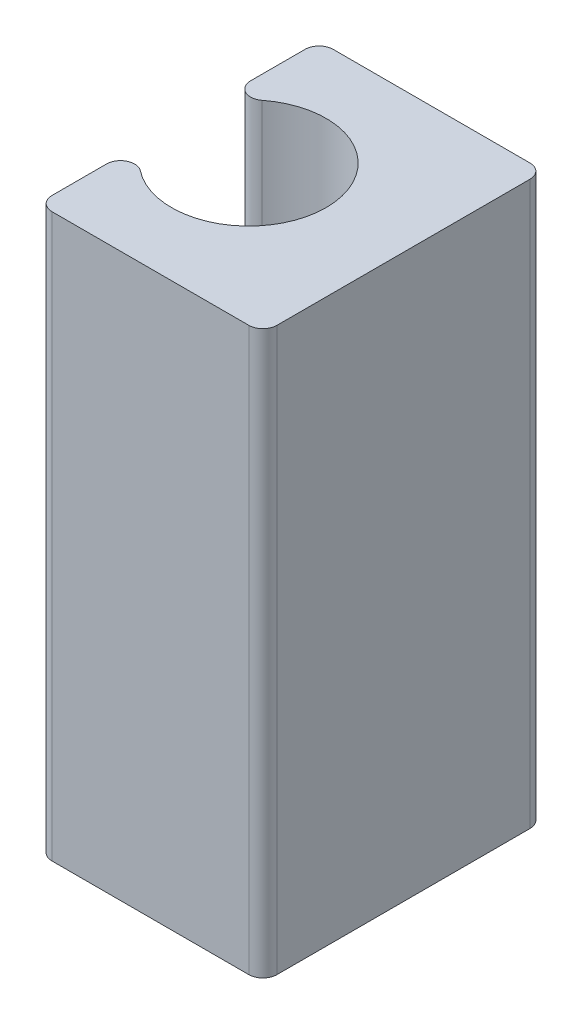
ISO-10303-21;
HEADER;
FILE_DESCRIPTION(('STEP AP214'),'2;1');
FILE_NAME('part.step','',(''),(''),'','','');
FILE_SCHEMA(('AUTOMOTIVE_DESIGN { 1 0 10303 214 1 1 1 1 }'));
ENDSEC;
DATA;
#1=APPLICATION_CONTEXT('core data for automotive mechanical design processes');
#2=APPLICATION_PROTOCOL_DEFINITION('international standard','automotive_design',2000,#1);
#3=PRODUCT_CONTEXT('',#1,'mechanical');
#4=PRODUCT('Part','Part','',(#3));
#5=PRODUCT_RELATED_PRODUCT_CATEGORY('part','',(#4));
#6=PRODUCT_DEFINITION_FORMATION('','',#4);
#7=PRODUCT_DEFINITION_CONTEXT('part definition',#1,'design');
#8=PRODUCT_DEFINITION('design','',#6,#7);
#9=PRODUCT_DEFINITION_SHAPE('','',#8);
#10=(LENGTH_UNIT() NAMED_UNIT(*) SI_UNIT(.MILLI.,.METRE.));
#11=(NAMED_UNIT(*) PLANE_ANGLE_UNIT() SI_UNIT($,.RADIAN.));
#12=(NAMED_UNIT(*) SI_UNIT($,.STERADIAN.) SOLID_ANGLE_UNIT());
#13=UNCERTAINTY_MEASURE_WITH_UNIT(LENGTH_MEASURE(1.E-05),#10,'distance_accuracy_value','');
#14=(GEOMETRIC_REPRESENTATION_CONTEXT(3) GLOBAL_UNCERTAINTY_ASSIGNED_CONTEXT((#13)) GLOBAL_UNIT_ASSIGNED_CONTEXT((#10,
#11,#12)) REPRESENTATION_CONTEXT('',''));
#15=CARTESIAN_POINT('',(0.,0.,0.));
#16=DIRECTION('',(0.,0.,1.));
#17=DIRECTION('',(1.,0.,0.));
#18=AXIS2_PLACEMENT_3D('',#15,#16,#17);
#19=CARTESIAN_POINT('',(20.65,50.4,-20.6));
#20=DIRECTION('',(0.,-1.,0.));
#21=DIRECTION('',(0.,0.,-1.));
#22=AXIS2_PLACEMENT_3D('',#19,#20,#21);
#23=CYLINDRICAL_SURFACE('',#22,2.75);
#24=CARTESIAN_POINT('',(20.65,50.4,-20.6));
#25=DIRECTION('',(0.,-1.,0.));
#26=DIRECTION('',(0.,0.,-1.));
#27=AXIS2_PLACEMENT_3D('',#24,#25,#26);
#28=CIRCLE('',#27,2.75);
#29=CARTESIAN_POINT('',(18.9576923076923,50.4,-22.7676242004915));
#30=VERTEX_POINT('',#29);
#31=CARTESIAN_POINT('',(18.9576923076923,50.4,-18.4323757995085));
#32=VERTEX_POINT('',#31);
#33=EDGE_CURVE('E150',#30,#32,#28,.T.);
#34=ORIENTED_EDGE('',*,*,#33,.F.);
#35=DIRECTION('',(0.,-1.,0.));
#36=VECTOR('',#35,1.);
#37=CARTESIAN_POINT('',(18.9576923076923,50.4,-22.7676242004915));
#38=LINE('',#37,#36);
#39=CARTESIAN_POINT('',(18.9576923076923,30.4,-22.7676242004915));
#40=VERTEX_POINT('',#39);
#41=EDGE_CURVE('E11',#30,#40,#38,.T.);
#42=ORIENTED_EDGE('',*,*,#41,.T.);
#43=CARTESIAN_POINT('',(20.65,30.4,-20.6));
#44=DIRECTION('',(0.,-1.,0.));
#45=DIRECTION('',(0.,0.,-1.));
#46=AXIS2_PLACEMENT_3D('',#43,#44,#45);
#47=CIRCLE('',#46,2.75);
#48=CARTESIAN_POINT('',(18.9576923076923,30.4,-18.4323757995085));
#49=VERTEX_POINT('',#48);
#50=EDGE_CURVE('E200',#40,#49,#47,.T.);
#51=ORIENTED_EDGE('',*,*,#50,.T.);
#52=DIRECTION('',(0.,-1.,0.));
#53=VECTOR('',#52,1.);
#54=CARTESIAN_POINT('',(18.9576923076923,50.4,-18.4323757995085));
#55=LINE('',#54,#53);
#56=EDGE_CURVE('E40',#49,#32,#55,.F.);
#57=ORIENTED_EDGE('',*,*,#56,.T.);
#58=EDGE_LOOP('',(#34,#42,#51,#57));
#59=FACE_BOUND('',#58,.T.);
#60=ADVANCED_FACE('F32',(#59),#23,.F.);
#61=CARTESIAN_POINT('',(18.15,50.4,-15.6));
#62=DIRECTION('',(1.,0.,0.));
#63=DIRECTION('',(0.,0.,-1.));
#64=AXIS2_PLACEMENT_3D('',#61,#62,#63);
#65=PLANE('',#64);
#66=DIRECTION('',(0.,0.,1.));
#67=VECTOR('',#66,1.);
#68=CARTESIAN_POINT('',(18.15,30.4,-15.6));
#69=LINE('',#68,#67);
#70=CARTESIAN_POINT('',(18.15,30.4,-18.0382623085101));
#71=VERTEX_POINT('',#70);
#72=CARTESIAN_POINT('',(18.15,30.4,-16.1));
#73=VERTEX_POINT('',#72);
#74=EDGE_CURVE('E213',#71,#73,#69,.T.);
#75=ORIENTED_EDGE('',*,*,#74,.T.);
#76=DIRECTION('',(0.,-1.,0.));
#77=VECTOR('',#76,1.);
#78=CARTESIAN_POINT('',(18.15,50.4,-16.1));
#79=LINE('',#78,#77);
#80=CARTESIAN_POINT('',(18.15,50.4,-16.1));
#81=VERTEX_POINT('',#80);
#82=EDGE_CURVE('E194',#73,#81,#79,.F.);
#83=ORIENTED_EDGE('',*,*,#82,.T.);
#84=DIRECTION('',(0.,0.,1.));
#85=VECTOR('',#84,1.);
#86=CARTESIAN_POINT('',(18.15,50.4,-19.454356076261));
#87=LINE('',#86,#85);
#88=CARTESIAN_POINT('',(18.15,50.4,-18.0382623085101));
#89=VERTEX_POINT('',#88);
#90=EDGE_CURVE('E154',#89,#81,#87,.T.);
#91=ORIENTED_EDGE('',*,*,#90,.F.);
#92=DIRECTION('',(0.,-1.,0.));
#93=VECTOR('',#92,1.);
#94=CARTESIAN_POINT('',(18.15,50.4,-18.0382623085101));
#95=LINE('',#94,#93);
#96=EDGE_CURVE('E191',#89,#71,#95,.T.);
#97=ORIENTED_EDGE('',*,*,#96,.T.);
#98=EDGE_LOOP('',(#75,#83,#91,#97));
#99=FACE_BOUND('',#98,.T.);
#100=ADVANCED_FACE('F212',(#99),#65,.F.);
#101=CARTESIAN_POINT('',(26.15,50.4,-15.6));
#102=DIRECTION('',(0.,0.,-1.));
#103=DIRECTION('',(-1.,0.,0.));
#104=AXIS2_PLACEMENT_3D('',#101,#102,#103);
#105=PLANE('',#104);
#106=DIRECTION('',(1.,0.,0.));
#107=VECTOR('',#106,1.);
#108=CARTESIAN_POINT('',(26.15,30.4,-15.6));
#109=LINE('',#108,#107);
#110=CARTESIAN_POINT('',(18.65,30.4,-15.6));
#111=VERTEX_POINT('',#110);
#112=CARTESIAN_POINT('',(25.65,30.4,-15.6));
#113=VERTEX_POINT('',#112);
#114=EDGE_CURVE('E216',#111,#113,#109,.T.);
#115=ORIENTED_EDGE('',*,*,#114,.T.);
#116=DIRECTION('',(0.,-1.,0.));
#117=VECTOR('',#116,1.);
#118=CARTESIAN_POINT('',(25.65,50.4,-15.6));
#119=LINE('',#118,#117);
#120=CARTESIAN_POINT('',(25.65,50.4,-15.6));
#121=VERTEX_POINT('',#120);
#122=EDGE_CURVE('E189',#113,#121,#119,.F.);
#123=ORIENTED_EDGE('',*,*,#122,.T.);
#124=DIRECTION('',(1.,0.,0.));
#125=VECTOR('',#124,1.);
#126=CARTESIAN_POINT('',(26.15,50.4,-15.6));
#127=LINE('',#126,#125);
#128=CARTESIAN_POINT('',(18.65,50.4,-15.6));
#129=VERTEX_POINT('',#128);
#130=EDGE_CURVE('E235',#129,#121,#127,.T.);
#131=ORIENTED_EDGE('',*,*,#130,.F.);
#132=DIRECTION('',(0.,-1.,0.));
#133=VECTOR('',#132,1.);
#134=CARTESIAN_POINT('',(18.65,50.4,-15.6));
#135=LINE('',#134,#133);
#136=EDGE_CURVE('E186',#129,#111,#135,.T.);
#137=ORIENTED_EDGE('',*,*,#136,.T.);
#138=EDGE_LOOP('',(#115,#123,#131,#137));
#139=FACE_BOUND('',#138,.T.);
#140=ADVANCED_FACE('F245',(#139),#105,.F.);
#141=CARTESIAN_POINT('',(26.15,50.4,-25.6));
#142=DIRECTION('',(-1.,0.,0.));
#143=DIRECTION('',(0.,0.,1.));
#144=AXIS2_PLACEMENT_3D('',#141,#142,#143);
#145=PLANE('',#144);
#146=DIRECTION('',(0.,0.,-1.));
#147=VECTOR('',#146,1.);
#148=CARTESIAN_POINT('',(26.15,30.4,-25.6));
#149=LINE('',#148,#147);
#150=CARTESIAN_POINT('',(26.15,30.4,-16.1));
#151=VERTEX_POINT('',#150);
#152=CARTESIAN_POINT('',(26.15,30.4,-25.1));
#153=VERTEX_POINT('',#152);
#154=EDGE_CURVE('E156',#151,#153,#149,.T.);
#155=ORIENTED_EDGE('',*,*,#154,.T.);
#156=DIRECTION('',(0.,-1.,0.));
#157=VECTOR('',#156,1.);
#158=CARTESIAN_POINT('',(26.15,50.4,-25.1));
#159=LINE('',#158,#157);
#160=CARTESIAN_POINT('',(26.15,50.4,-25.1));
#161=VERTEX_POINT('',#160);
#162=EDGE_CURVE('E47',#153,#161,#159,.F.);
#163=ORIENTED_EDGE('',*,*,#162,.T.);
#164=DIRECTION('',(0.,0.,-1.));
#165=VECTOR('',#164,1.);
#166=CARTESIAN_POINT('',(26.15,50.4,-25.6));
#167=LINE('',#166,#165);
#168=CARTESIAN_POINT('',(26.15,50.4,-16.1));
#169=VERTEX_POINT('',#168);
#170=EDGE_CURVE('E231',#169,#161,#167,.T.);
#171=ORIENTED_EDGE('',*,*,#170,.F.);
#172=DIRECTION('',(0.,-1.,0.));
#173=VECTOR('',#172,1.);
#174=CARTESIAN_POINT('',(26.15,50.4,-16.1));
#175=LINE('',#174,#173);
#176=EDGE_CURVE('E182',#169,#151,#175,.T.);
#177=ORIENTED_EDGE('',*,*,#176,.T.);
#178=EDGE_LOOP('',(#155,#163,#171,#177));
#179=FACE_BOUND('',#178,.T.);
#180=ADVANCED_FACE('F223',(#179),#145,.F.);
#181=CARTESIAN_POINT('',(18.15,50.4,-25.6));
#182=DIRECTION('',(0.,0.,1.));
#183=DIRECTION('',(1.,0.,0.));
#184=AXIS2_PLACEMENT_3D('',#181,#182,#183);
#185=PLANE('',#184);
#186=DIRECTION('',(-1.,0.,0.));
#187=VECTOR('',#186,1.);
#188=CARTESIAN_POINT('',(18.15,30.4,-25.6));
#189=LINE('',#188,#187);
#190=CARTESIAN_POINT('',(25.65,30.4,-25.6));
#191=VERTEX_POINT('',#190);
#192=CARTESIAN_POINT('',(18.65,30.4,-25.6));
#193=VERTEX_POINT('',#192);
#194=EDGE_CURVE('E151',#191,#193,#189,.T.);
#195=ORIENTED_EDGE('',*,*,#194,.T.);
#196=DIRECTION('',(0.,-1.,0.));
#197=VECTOR('',#196,1.);
#198=CARTESIAN_POINT('',(18.65,50.4,-25.6));
#199=LINE('',#198,#197);
#200=CARTESIAN_POINT('',(18.65,50.4,-25.6));
#201=VERTEX_POINT('',#200);
#202=EDGE_CURVE('E128',#193,#201,#199,.F.);
#203=ORIENTED_EDGE('',*,*,#202,.T.);
#204=DIRECTION('',(-1.,0.,0.));
#205=VECTOR('',#204,1.);
#206=CARTESIAN_POINT('',(18.15,50.4,-25.6));
#207=LINE('',#206,#205);
#208=CARTESIAN_POINT('',(25.65,50.4,-25.6));
#209=VERTEX_POINT('',#208);
#210=EDGE_CURVE('E230',#209,#201,#207,.T.);
#211=ORIENTED_EDGE('',*,*,#210,.F.);
#212=DIRECTION('',(0.,-1.,0.));
#213=VECTOR('',#212,1.);
#214=CARTESIAN_POINT('',(25.65,50.4,-25.6));
#215=LINE('',#214,#213);
#216=EDGE_CURVE('E133',#209,#191,#215,.T.);
#217=ORIENTED_EDGE('',*,*,#216,.T.);
#218=EDGE_LOOP('',(#195,#203,#211,#217));
#219=FACE_BOUND('',#218,.T.);
#220=ADVANCED_FACE('F233',(#219),#185,.F.);
#221=CARTESIAN_POINT('',(18.15,50.4,-24.6388736053509));
#222=DIRECTION('',(1.,0.,0.));
#223=DIRECTION('',(0.,0.,-1.));
#224=AXIS2_PLACEMENT_3D('',#221,#222,#223);
#225=PLANE('',#224);
#226=DIRECTION('',(0.,0.,1.));
#227=VECTOR('',#226,1.);
#228=CARTESIAN_POINT('',(18.15,50.4,-24.6388736053509));
#229=LINE('',#228,#227);
#230=CARTESIAN_POINT('',(18.15,50.4,-25.1));
#231=VERTEX_POINT('',#230);
#232=CARTESIAN_POINT('',(18.15,50.4,-23.1617376914899));
#233=VERTEX_POINT('',#232);
#234=EDGE_CURVE('E143',#231,#233,#229,.T.);
#235=ORIENTED_EDGE('',*,*,#234,.F.);
#236=DIRECTION('',(0.,-1.,0.));
#237=VECTOR('',#236,1.);
#238=CARTESIAN_POINT('',(18.15,50.4,-25.1));
#239=LINE('',#238,#237);
#240=CARTESIAN_POINT('',(18.15,30.4,-25.1));
#241=VERTEX_POINT('',#240);
#242=EDGE_CURVE('E127',#231,#241,#239,.T.);
#243=ORIENTED_EDGE('',*,*,#242,.T.);
#244=DIRECTION('',(0.,0.,1.));
#245=VECTOR('',#244,1.);
#246=CARTESIAN_POINT('',(18.15,30.4,-24.6388736053509));
#247=LINE('',#246,#245);
#248=CARTESIAN_POINT('',(18.15,30.4,-23.1617376914899));
#249=VERTEX_POINT('',#248);
#250=EDGE_CURVE('E140',#241,#249,#247,.T.);
#251=ORIENTED_EDGE('',*,*,#250,.T.);
#252=DIRECTION('',(0.,-1.,0.));
#253=VECTOR('',#252,1.);
#254=CARTESIAN_POINT('',(18.15,50.4,-23.1617376914899));
#255=LINE('',#254,#253);
#256=EDGE_CURVE('E145',#249,#233,#255,.F.);
#257=ORIENTED_EDGE('',*,*,#256,.T.);
#258=EDGE_LOOP('',(#235,#243,#251,#257));
#259=FACE_BOUND('',#258,.T.);
#260=ADVANCED_FACE('F139',(#259),#225,.F.);
#261=CARTESIAN_POINT('',(20.65,50.4,-20.6));
#262=DIRECTION('',(0.,-1.,0.));
#263=DIRECTION('',(0.,0.,-1.));
#264=AXIS2_PLACEMENT_3D('',#261,#262,#263);
#265=PLANE('',#264);
#266=ORIENTED_EDGE('',*,*,#210,.T.);
#267=CARTESIAN_POINT('',(18.65,50.4,-25.1));
#268=DIRECTION('',(0.,-1.,0.));
#269=DIRECTION('',(0.,0.,-1.));
#270=AXIS2_PLACEMENT_3D('',#267,#268,#269);
#271=CIRCLE('',#270,0.5);
#272=EDGE_CURVE('E180',#201,#231,#271,.F.);
#273=ORIENTED_EDGE('',*,*,#272,.T.);
#274=ORIENTED_EDGE('',*,*,#234,.T.);
#275=CARTESIAN_POINT('',(18.65,50.4,-23.1617376914899));
#276=DIRECTION('',(0.,-1.,0.));
#277=DIRECTION('',(0.,0.,-1.));
#278=AXIS2_PLACEMENT_3D('',#275,#276,#277);
#279=CIRCLE('',#278,0.5);
#280=EDGE_CURVE('E173',#233,#30,#279,.F.);
#281=ORIENTED_EDGE('',*,*,#280,.T.);
#282=ORIENTED_EDGE('',*,*,#33,.T.);
#283=CARTESIAN_POINT('',(18.65,50.4,-18.0382623085101));
#284=DIRECTION('',(0.,-1.,0.));
#285=DIRECTION('',(0.,0.,-1.));
#286=AXIS2_PLACEMENT_3D('',#283,#284,#285);
#287=CIRCLE('',#286,0.5);
#288=EDGE_CURVE('E171',#32,#89,#287,.F.);
#289=ORIENTED_EDGE('',*,*,#288,.T.);
#290=ORIENTED_EDGE('',*,*,#90,.T.);
#291=CARTESIAN_POINT('',(18.65,50.4,-16.1));
#292=DIRECTION('',(0.,-1.,0.));
#293=DIRECTION('',(0.,0.,-1.));
#294=AXIS2_PLACEMENT_3D('',#291,#292,#293);
#295=CIRCLE('',#294,0.5);
#296=EDGE_CURVE('E175',#81,#129,#295,.F.);
#297=ORIENTED_EDGE('',*,*,#296,.T.);
#298=ORIENTED_EDGE('',*,*,#130,.T.);
#299=CARTESIAN_POINT('',(25.65,50.4,-16.1));
#300=DIRECTION('',(0.,-1.,0.));
#301=DIRECTION('',(0.,0.,-1.));
#302=AXIS2_PLACEMENT_3D('',#299,#300,#301);
#303=CIRCLE('',#302,0.5);
#304=EDGE_CURVE('E54',#121,#169,#303,.F.);
#305=ORIENTED_EDGE('',*,*,#304,.T.);
#306=ORIENTED_EDGE('',*,*,#170,.T.);
#307=CARTESIAN_POINT('',(25.65,50.4,-25.1));
#308=DIRECTION('',(0.,-1.,0.));
#309=DIRECTION('',(0.,0.,-1.));
#310=AXIS2_PLACEMENT_3D('',#307,#308,#309);
#311=CIRCLE('',#310,0.5);
#312=EDGE_CURVE('E178',#161,#209,#311,.F.);
#313=ORIENTED_EDGE('',*,*,#312,.T.);
#314=EDGE_LOOP('',(#266,#273,#274,#281,#282,#289,#290,#297,#298,#305,#306,#313));
#315=FACE_BOUND('',#314,.T.);
#316=ADVANCED_FACE('F204',(#315),#265,.F.);
#317=CARTESIAN_POINT('',(20.65,30.4,-20.6));
#318=DIRECTION('',(0.,-1.,0.));
#319=DIRECTION('',(0.,0.,-1.));
#320=AXIS2_PLACEMENT_3D('',#317,#318,#319);
#321=PLANE('',#320);
#322=ORIENTED_EDGE('',*,*,#250,.F.);
#323=CARTESIAN_POINT('',(18.65,30.4,-25.1));
#324=DIRECTION('',(0.,-1.,0.));
#325=DIRECTION('',(0.,0.,-1.));
#326=AXIS2_PLACEMENT_3D('',#323,#324,#325);
#327=CIRCLE('',#326,0.5);
#328=EDGE_CURVE('E123',#241,#193,#327,.T.);
#329=ORIENTED_EDGE('',*,*,#328,.T.);
#330=ORIENTED_EDGE('',*,*,#194,.F.);
#331=CARTESIAN_POINT('',(25.65,30.4,-25.1));
#332=DIRECTION('',(0.,-1.,0.));
#333=DIRECTION('',(0.,0.,-1.));
#334=AXIS2_PLACEMENT_3D('',#331,#332,#333);
#335=CIRCLE('',#334,0.5);
#336=EDGE_CURVE('E134',#191,#153,#335,.T.);
#337=ORIENTED_EDGE('',*,*,#336,.T.);
#338=ORIENTED_EDGE('',*,*,#154,.F.);
#339=CARTESIAN_POINT('',(25.65,30.4,-16.1));
#340=DIRECTION('',(0.,-1.,0.));
#341=DIRECTION('',(0.,0.,-1.));
#342=AXIS2_PLACEMENT_3D('',#339,#340,#341);
#343=CIRCLE('',#342,0.5);
#344=EDGE_CURVE('E165',#151,#113,#343,.T.);
#345=ORIENTED_EDGE('',*,*,#344,.T.);
#346=ORIENTED_EDGE('',*,*,#114,.F.);
#347=CARTESIAN_POINT('',(18.65,30.4,-16.1));
#348=DIRECTION('',(0.,-1.,0.));
#349=DIRECTION('',(0.,0.,-1.));
#350=AXIS2_PLACEMENT_3D('',#347,#348,#349);
#351=CIRCLE('',#350,0.5);
#352=EDGE_CURVE('E163',#111,#73,#351,.T.);
#353=ORIENTED_EDGE('',*,*,#352,.T.);
#354=ORIENTED_EDGE('',*,*,#74,.F.);
#355=CARTESIAN_POINT('',(18.65,30.4,-18.0382623085101));
#356=DIRECTION('',(0.,-1.,0.));
#357=DIRECTION('',(0.,0.,-1.));
#358=AXIS2_PLACEMENT_3D('',#355,#356,#357);
#359=CIRCLE('',#358,0.5);
#360=EDGE_CURVE('E144',#71,#49,#359,.T.);
#361=ORIENTED_EDGE('',*,*,#360,.T.);
#362=ORIENTED_EDGE('',*,*,#50,.F.);
#363=CARTESIAN_POINT('',(18.65,30.4,-23.1617376914899));
#364=DIRECTION('',(0.,-1.,0.));
#365=DIRECTION('',(0.,0.,-1.));
#366=AXIS2_PLACEMENT_3D('',#363,#364,#365);
#367=CIRCLE('',#366,0.5);
#368=EDGE_CURVE('E149',#40,#249,#367,.T.);
#369=ORIENTED_EDGE('',*,*,#368,.T.);
#370=EDGE_LOOP('',(#322,#329,#330,#337,#338,#345,#346,#353,#354,#361,#362,#369));
#371=FACE_BOUND('',#370,.T.);
#372=ADVANCED_FACE('F147',(#371),#321,.T.);
#373=CARTESIAN_POINT('',(18.65,50.4,-25.1));
#374=DIRECTION('',(0.,-1.,0.));
#375=DIRECTION('',(0.,0.,-1.));
#376=AXIS2_PLACEMENT_3D('',#373,#374,#375);
#377=CYLINDRICAL_SURFACE('',#376,0.5);
#378=ORIENTED_EDGE('',*,*,#272,.F.);
#379=ORIENTED_EDGE('',*,*,#202,.F.);
#380=ORIENTED_EDGE('',*,*,#328,.F.);
#381=ORIENTED_EDGE('',*,*,#242,.F.);
#382=EDGE_LOOP('',(#378,#379,#380,#381));
#383=FACE_BOUND('',#382,.T.);
#384=ADVANCED_FACE('F126',(#383),#377,.T.);
#385=CARTESIAN_POINT('',(25.65,50.4,-25.1));
#386=DIRECTION('',(0.,-1.,0.));
#387=DIRECTION('',(0.,0.,-1.));
#388=AXIS2_PLACEMENT_3D('',#385,#386,#387);
#389=CYLINDRICAL_SURFACE('',#388,0.5);
#390=ORIENTED_EDGE('',*,*,#312,.F.);
#391=ORIENTED_EDGE('',*,*,#162,.F.);
#392=ORIENTED_EDGE('',*,*,#336,.F.);
#393=ORIENTED_EDGE('',*,*,#216,.F.);
#394=EDGE_LOOP('',(#390,#391,#392,#393));
#395=FACE_BOUND('',#394,.T.);
#396=ADVANCED_FACE('F227',(#395),#389,.T.);
#397=CARTESIAN_POINT('',(25.65,50.4,-16.1));
#398=DIRECTION('',(0.,-1.,0.));
#399=DIRECTION('',(0.,0.,-1.));
#400=AXIS2_PLACEMENT_3D('',#397,#398,#399);
#401=CYLINDRICAL_SURFACE('',#400,0.5);
#402=ORIENTED_EDGE('',*,*,#304,.F.);
#403=ORIENTED_EDGE('',*,*,#122,.F.);
#404=ORIENTED_EDGE('',*,*,#344,.F.);
#405=ORIENTED_EDGE('',*,*,#176,.F.);
#406=EDGE_LOOP('',(#402,#403,#404,#405));
#407=FACE_BOUND('',#406,.T.);
#408=ADVANCED_FACE('F248',(#407),#401,.T.);
#409=CARTESIAN_POINT('',(18.65,50.4,-16.1));
#410=DIRECTION('',(0.,-1.,0.));
#411=DIRECTION('',(0.,0.,-1.));
#412=AXIS2_PLACEMENT_3D('',#409,#410,#411);
#413=CYLINDRICAL_SURFACE('',#412,0.5);
#414=ORIENTED_EDGE('',*,*,#296,.F.);
#415=ORIENTED_EDGE('',*,*,#82,.F.);
#416=ORIENTED_EDGE('',*,*,#352,.F.);
#417=ORIENTED_EDGE('',*,*,#136,.F.);
#418=EDGE_LOOP('',(#414,#415,#416,#417));
#419=FACE_BOUND('',#418,.T.);
#420=ADVANCED_FACE('F243',(#419),#413,.T.);
#421=CARTESIAN_POINT('',(18.65,50.4,-23.1617376914899));
#422=DIRECTION('',(0.,-1.,0.));
#423=DIRECTION('',(0.,0.,-1.));
#424=AXIS2_PLACEMENT_3D('',#421,#422,#423);
#425=CYLINDRICAL_SURFACE('',#424,0.5);
#426=ORIENTED_EDGE('',*,*,#280,.F.);
#427=ORIENTED_EDGE('',*,*,#256,.F.);
#428=ORIENTED_EDGE('',*,*,#368,.F.);
#429=ORIENTED_EDGE('',*,*,#41,.F.);
#430=EDGE_LOOP('',(#426,#427,#428,#429));
#431=FACE_BOUND('',#430,.T.);
#432=ADVANCED_FACE('F255',(#431),#425,.T.);
#433=CARTESIAN_POINT('',(18.65,50.4,-18.0382623085101));
#434=DIRECTION('',(0.,-1.,0.));
#435=DIRECTION('',(0.,0.,-1.));
#436=AXIS2_PLACEMENT_3D('',#433,#434,#435);
#437=CYLINDRICAL_SURFACE('',#436,0.5);
#438=ORIENTED_EDGE('',*,*,#288,.F.);
#439=ORIENTED_EDGE('',*,*,#56,.F.);
#440=ORIENTED_EDGE('',*,*,#360,.F.);
#441=ORIENTED_EDGE('',*,*,#96,.F.);
#442=EDGE_LOOP('',(#438,#439,#440,#441));
#443=FACE_BOUND('',#442,.T.);
#444=ADVANCED_FACE('F34',(#443),#437,.T.);
#445=CLOSED_SHELL('',(#60,#100,#140,#180,#220,#260,#316,#372,#384,#396,#408,#420,#432,#444));
#446=MANIFOLD_SOLID_BREP('B2',#445);
#447=ADVANCED_BREP_SHAPE_REPRESENTATION('',(#18,#446),#14);
#448=SHAPE_DEFINITION_REPRESENTATION(#9,#447);
ENDSEC;
END-ISO-10303-21;
